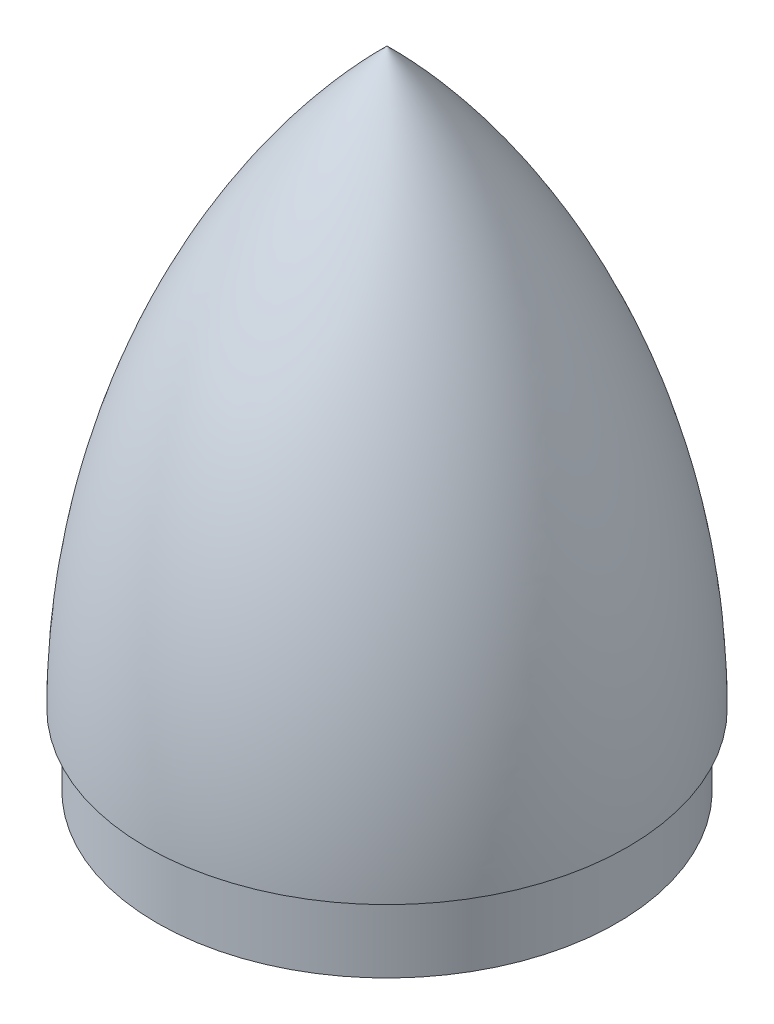
ISO-10303-21;
HEADER;
FILE_DESCRIPTION(('STEP AP214'),'2;1');
FILE_NAME('part.step','',(''),(''),'','','');
FILE_SCHEMA(('AUTOMOTIVE_DESIGN { 1 0 10303 214 1 1 1 1 }'));
ENDSEC;
DATA;
#1=APPLICATION_CONTEXT('core data for automotive mechanical design processes');
#2=APPLICATION_PROTOCOL_DEFINITION('international standard','automotive_design',2000,#1);
#3=PRODUCT_CONTEXT('',#1,'mechanical');
#4=PRODUCT('Part','Part','',(#3));
#5=PRODUCT_RELATED_PRODUCT_CATEGORY('part','',(#4));
#6=PRODUCT_DEFINITION_FORMATION('','',#4);
#7=PRODUCT_DEFINITION_CONTEXT('part definition',#1,'design');
#8=PRODUCT_DEFINITION('design','',#6,#7);
#9=PRODUCT_DEFINITION_SHAPE('','',#8);
#10=(LENGTH_UNIT() NAMED_UNIT(*) SI_UNIT(.MILLI.,.METRE.));
#11=(NAMED_UNIT(*) PLANE_ANGLE_UNIT() SI_UNIT($,.RADIAN.));
#12=(NAMED_UNIT(*) SI_UNIT($,.STERADIAN.) SOLID_ANGLE_UNIT());
#13=UNCERTAINTY_MEASURE_WITH_UNIT(LENGTH_MEASURE(1.E-05),#10,'distance_accuracy_value','');
#14=(GEOMETRIC_REPRESENTATION_CONTEXT(3) GLOBAL_UNCERTAINTY_ASSIGNED_CONTEXT((#13)) GLOBAL_UNIT_ASSIGNED_CONTEXT((#10,
#11,#12)) REPRESENTATION_CONTEXT('',''));
#15=CARTESIAN_POINT('',(0.,0.,0.));
#16=DIRECTION('',(0.,0.,1.));
#17=DIRECTION('',(1.,0.,0.));
#18=AXIS2_PLACEMENT_3D('',#15,#16,#17);
#19=CARTESIAN_POINT('',(0.,12.7,100.665697674419));
#20=DIRECTION('',(-1.,0.,0.));
#21=DIRECTION('',(0.,0.,-1.));
#22=AXIS2_PLACEMENT_3D('',#19,#20,#21);
#23=CIRCLE('',#22,143.665697674419);
#24=TRIMMED_CURVE('',#23,(PARAMETER_VALUE(-0.79442652058352)),
(PARAMETER_VALUE(0.79442652058352)),.T.,.PARAMETER.);
#25=CARTESIAN_POINT('',(0.,12.7,0.));
#26=DIRECTION('',(0.,-1.,0.));
#27=AXIS1_PLACEMENT('',#25,#26);
#28=SURFACE_OF_REVOLUTION('',#24,#27);
#29=CARTESIAN_POINT('',(0.,12.6999999999999,0.));
#30=DIRECTION('',(0.,-1.,0.));
#31=DIRECTION('',(0.,0.,-1.));
#32=AXIS2_PLACEMENT_3D('',#29,#30,#31);
#33=CIRCLE('',#32,43.);
#34=CARTESIAN_POINT('',(0.,12.6999999999999,-43.));
#35=VERTEX_POINT('',#34);
#36=EDGE_CURVE('E72',#35,#35,#33,.T.);
#37=ORIENTED_EDGE('',*,*,#36,.F.);
#38=EDGE_LOOP('',(#37));
#39=FACE_BOUND('',#38,.T.);
#40=CARTESIAN_POINT('',(0.,115.2,0.));
#41=VERTEX_POINT('',#40);
#42=VERTEX_LOOP('',#41);
#43=FACE_BOUND('',#42,.T.);
#44=ADVANCED_FACE('F39',(#39,#43),#28,.T.);
#45=CARTESIAN_POINT('',(0.,12.7,100.665697674419));
#46=DIRECTION('',(-1.,0.,0.));
#47=DIRECTION('',(0.,0.,-1.));
#48=AXIS2_PLACEMENT_3D('',#45,#46,#47);
#49=CIRCLE('',#48,142.665697674419);
#50=TRIMMED_CURVE('',#49,(PARAMETER_VALUE(-0.787519080433809)),
(PARAMETER_VALUE(0.787519080433809)),.T.,.PARAMETER.);
#51=CARTESIAN_POINT('',(0.,12.7,0.));
#52=DIRECTION('',(0.,-1.,0.));
#53=AXIS1_PLACEMENT('',#51,#52);
#54=SURFACE_OF_REVOLUTION('',#50,#53);
#55=CARTESIAN_POINT('',(0.,113.793613075462,0.));
#56=VERTEX_POINT('',#55);
#57=VERTEX_LOOP('',#56);
#58=FACE_BOUND('',#57,.T.);
#59=CARTESIAN_POINT('',(0.,35.9060261820672,0.));
#60=DIRECTION('',(0.,-1.,0.));
#61=DIRECTION('',(0.,0.,-1.));
#62=AXIS2_PLACEMENT_3D('',#59,#60,#61);
#63=CIRCLE('',#62,40.1);
#64=CARTESIAN_POINT('',(0.,35.9060261820672,-40.1));
#65=VERTEX_POINT('',#64);
#66=EDGE_CURVE('E11',#65,#65,#63,.T.);
#67=ORIENTED_EDGE('',*,*,#66,.T.);
#68=EDGE_LOOP('',(#67));
#69=FACE_BOUND('',#68,.T.);
#70=ADVANCED_FACE('F52',(#58,#69),#54,.F.);
#71=CARTESIAN_POINT('',(0.,-1000.,0.));
#72=DIRECTION('',(0.,-1.,0.));
#73=DIRECTION('',(0.,0.,-1.));
#74=AXIS2_PLACEMENT_3D('',#71,#72,#73);
#75=CYLINDRICAL_SURFACE('',#74,40.1);
#76=ORIENTED_EDGE('',*,*,#66,.F.);
#77=EDGE_LOOP('',(#76));
#78=FACE_BOUND('',#77,.T.);
#79=CARTESIAN_POINT('',(0.,-1.11022302462516E-13,0.));
#80=DIRECTION('',(0.,-1.,0.));
#81=DIRECTION('',(0.,0.,-1.));
#82=AXIS2_PLACEMENT_3D('',#79,#80,#81);
#83=CIRCLE('',#82,40.1);
#84=CARTESIAN_POINT('',(0.,-1.11022302462516E-13,-40.1));
#85=VERTEX_POINT('',#84);
#86=EDGE_CURVE('E46',#85,#85,#83,.T.);
#87=ORIENTED_EDGE('',*,*,#86,.T.);
#88=EDGE_LOOP('',(#87));
#89=FACE_BOUND('',#88,.T.);
#90=ADVANCED_FACE('F55',(#78,#89),#75,.F.);
#91=CARTESIAN_POINT('',(-40.1,0.,0.));
#92=DIRECTION('',(0.,1.,0.));
#93=DIRECTION('',(0.,0.,1.));
#94=AXIS2_PLACEMENT_3D('',#91,#92,#93);
#95=PLANE('',#94);
#96=ORIENTED_EDGE('',*,*,#86,.F.);
#97=EDGE_LOOP('',(#96));
#98=FACE_BOUND('',#97,.T.);
#99=CARTESIAN_POINT('',(0.,0.,0.));
#100=DIRECTION('',(0.,-1.,0.));
#101=DIRECTION('',(0.,0.,-1.));
#102=AXIS2_PLACEMENT_3D('',#99,#100,#101);
#103=CIRCLE('',#102,41.1);
#104=CARTESIAN_POINT('',(0.,0.,-41.1));
#105=VERTEX_POINT('',#104);
#106=EDGE_CURVE('E65',#105,#105,#103,.T.);
#107=ORIENTED_EDGE('',*,*,#106,.T.);
#108=EDGE_LOOP('',(#107));
#109=FACE_BOUND('',#108,.T.);
#110=ADVANCED_FACE('F60',(#98,#109),#95,.F.);
#111=CARTESIAN_POINT('',(0.,-1000.,0.));
#112=DIRECTION('',(0.,-1.,0.));
#113=DIRECTION('',(0.,0.,-1.));
#114=AXIS2_PLACEMENT_3D('',#111,#112,#113);
#115=CYLINDRICAL_SURFACE('',#114,41.1);
#116=ORIENTED_EDGE('',*,*,#106,.F.);
#117=EDGE_LOOP('',(#116));
#118=FACE_BOUND('',#117,.T.);
#119=CARTESIAN_POINT('',(0.,12.6999999999999,0.));
#120=DIRECTION('',(0.,-1.,0.));
#121=DIRECTION('',(0.,0.,-1.));
#122=AXIS2_PLACEMENT_3D('',#119,#120,#121);
#123=CIRCLE('',#122,41.1);
#124=CARTESIAN_POINT('',(0.,12.6999999999999,-41.1));
#125=VERTEX_POINT('',#124);
#126=EDGE_CURVE('E67',#125,#125,#123,.T.);
#127=ORIENTED_EDGE('',*,*,#126,.T.);
#128=EDGE_LOOP('',(#127));
#129=FACE_BOUND('',#128,.T.);
#130=ADVANCED_FACE('F98',(#118,#129),#115,.T.);
#131=CARTESIAN_POINT('',(-41.1,12.7,0.));
#132=DIRECTION('',(0.,1.,0.));
#133=DIRECTION('',(0.,0.,1.));
#134=AXIS2_PLACEMENT_3D('',#131,#132,#133);
#135=PLANE('',#134);
#136=ORIENTED_EDGE('',*,*,#126,.F.);
#137=EDGE_LOOP('',(#136));
#138=FACE_BOUND('',#137,.T.);
#139=ORIENTED_EDGE('',*,*,#36,.T.);
#140=EDGE_LOOP('',(#139));
#141=FACE_BOUND('',#140,.T.);
#142=ADVANCED_FACE('F76',(#138,#141),#135,.F.);
#143=CLOSED_SHELL('',(#44,#70,#90,#110,#130,#142));
#144=MANIFOLD_SOLID_BREP('B2',#143);
#145=ADVANCED_BREP_SHAPE_REPRESENTATION('',(#18,#144),#14);
#146=SHAPE_DEFINITION_REPRESENTATION(#9,#145);
ENDSEC;
END-ISO-10303-21;
